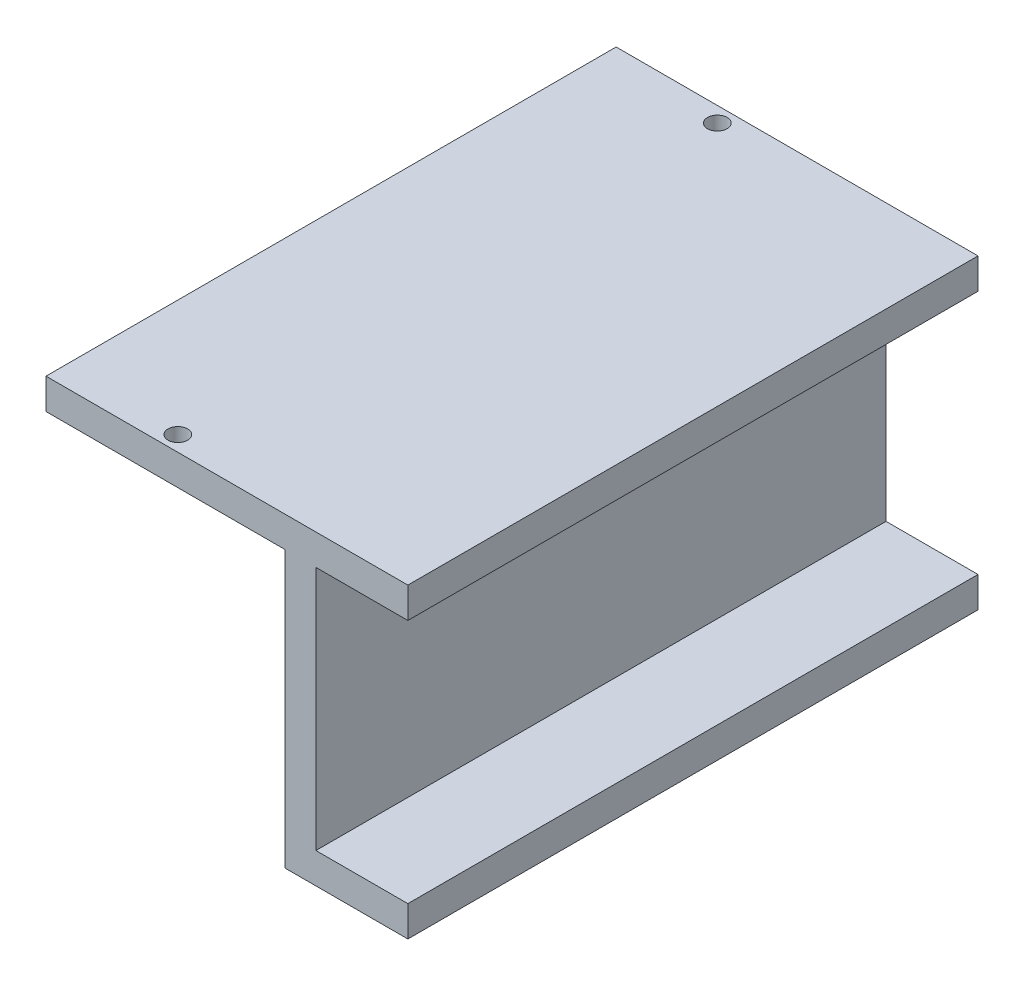
ISO-10303-21;
HEADER;
FILE_DESCRIPTION(('STEP AP214'),'2;1');
FILE_NAME('part.step','',(''),(''),'','','');
FILE_SCHEMA(('AUTOMOTIVE_DESIGN { 1 0 10303 214 1 1 1 1 }'));
ENDSEC;
DATA;
#1=APPLICATION_CONTEXT('core data for automotive mechanical design processes');
#2=APPLICATION_PROTOCOL_DEFINITION('international standard','automotive_design',2000,#1);
#3=PRODUCT_CONTEXT('',#1,'mechanical');
#4=PRODUCT('Part','Part','',(#3));
#5=PRODUCT_RELATED_PRODUCT_CATEGORY('part','',(#4));
#6=PRODUCT_DEFINITION_FORMATION('','',#4);
#7=PRODUCT_DEFINITION_CONTEXT('part definition',#1,'design');
#8=PRODUCT_DEFINITION('design','',#6,#7);
#9=PRODUCT_DEFINITION_SHAPE('','',#8);
#10=(LENGTH_UNIT() NAMED_UNIT(*) SI_UNIT(.MILLI.,.METRE.));
#11=(NAMED_UNIT(*) PLANE_ANGLE_UNIT() SI_UNIT($,.RADIAN.));
#12=(NAMED_UNIT(*) SI_UNIT($,.STERADIAN.) SOLID_ANGLE_UNIT());
#13=UNCERTAINTY_MEASURE_WITH_UNIT(LENGTH_MEASURE(1.E-05),#10,'distance_accuracy_value','');
#14=(GEOMETRIC_REPRESENTATION_CONTEXT(3) GLOBAL_UNCERTAINTY_ASSIGNED_CONTEXT((#13)) GLOBAL_UNIT_ASSIGNED_CONTEXT((#10,
#11,#12)) REPRESENTATION_CONTEXT('',''));
#15=CARTESIAN_POINT('',(0.,0.,0.));
#16=DIRECTION('',(0.,0.,1.));
#17=DIRECTION('',(1.,0.,0.));
#18=AXIS2_PLACEMENT_3D('',#15,#16,#17);
#19=CARTESIAN_POINT('',(-15.,-509.409867616983,-170.356079300492));
#20=DIRECTION('',(1.,0.,0.));
#21=DIRECTION('',(0.,0.,-1.));
#22=AXIS2_PLACEMENT_3D('',#19,#20,#21);
#23=PLANE('',#22);
#24=DIRECTION('',(0.,-1.,0.));
#25=VECTOR('',#24,1.);
#26=CARTESIAN_POINT('',(-15.,-509.409867616983,-93.));
#27=LINE('',#26,#25);
#28=CARTESIAN_POINT('',(-15.,-469.409867616982,-93.));
#29=VERTEX_POINT('',#28);
#30=CARTESIAN_POINT('',(-15.,-509.409867616983,-93.));
#31=VERTEX_POINT('',#30);
#32=EDGE_CURVE('E42',#29,#31,#27,.T.);
#33=ORIENTED_EDGE('',*,*,#32,.F.);
#34=DIRECTION('',(0.,0.,1.));
#35=VECTOR('',#34,1.);
#36=CARTESIAN_POINT('',(-15.,-469.409867616982,-170.356079300492));
#37=LINE('',#36,#35);
#38=CARTESIAN_POINT('',(-15.,-469.409867616982,0.));
#39=VERTEX_POINT('',#38);
#40=EDGE_CURVE('E109',#29,#39,#37,.T.);
#41=ORIENTED_EDGE('',*,*,#40,.T.);
#42=DIRECTION('',(0.,1.,0.));
#43=VECTOR('',#42,1.);
#44=CARTESIAN_POINT('',(-15.,-509.409867616983,0.));
#45=LINE('',#44,#43);
#46=CARTESIAN_POINT('',(-15.,-509.409867616983,0.));
#47=VERTEX_POINT('',#46);
#48=EDGE_CURVE('E113',#47,#39,#45,.T.);
#49=ORIENTED_EDGE('',*,*,#48,.F.);
#50=DIRECTION('',(0.,0.,1.));
#51=VECTOR('',#50,1.);
#52=CARTESIAN_POINT('',(-15.,-509.409867616983,-170.356079300492));
#53=LINE('',#52,#51);
#54=EDGE_CURVE('E158',#31,#47,#53,.T.);
#55=ORIENTED_EDGE('',*,*,#54,.F.);
#56=EDGE_LOOP('',(#33,#41,#49,#55));
#57=FACE_BOUND('',#56,.T.);
#58=ADVANCED_FACE('F35',(#57),#23,.T.);
#59=CARTESIAN_POINT('',(-15.,-509.409867616983,-170.356079300492));
#60=DIRECTION('',(0.,1.,0.));
#61=DIRECTION('',(0.,0.,1.));
#62=AXIS2_PLACEMENT_3D('',#59,#60,#61);
#63=PLANE('',#62);
#64=DIRECTION('',(1.,0.,0.));
#65=VECTOR('',#64,1.);
#66=CARTESIAN_POINT('',(-15.,-509.409867616983,-93.));
#67=LINE('',#66,#65);
#68=CARTESIAN_POINT('',(0.,-509.409867616983,-93.));
#69=VERTEX_POINT('',#68);
#70=EDGE_CURVE('E212',#31,#69,#67,.T.);
#71=ORIENTED_EDGE('',*,*,#70,.F.);
#72=ORIENTED_EDGE('',*,*,#54,.T.);
#73=DIRECTION('',(-1.,0.,0.));
#74=VECTOR('',#73,1.);
#75=CARTESIAN_POINT('',(-15.,-509.409867616983,0.));
#76=LINE('',#75,#74);
#77=CARTESIAN_POINT('',(0.,-509.409867616983,0.));
#78=VERTEX_POINT('',#77);
#79=EDGE_CURVE('E118',#78,#47,#76,.T.);
#80=ORIENTED_EDGE('',*,*,#79,.F.);
#81=DIRECTION('',(0.,0.,1.));
#82=VECTOR('',#81,1.);
#83=CARTESIAN_POINT('',(0.,-509.409867616983,-170.356079300492));
#84=LINE('',#83,#82);
#85=EDGE_CURVE('E161',#69,#78,#84,.T.);
#86=ORIENTED_EDGE('',*,*,#85,.F.);
#87=EDGE_LOOP('',(#71,#72,#80,#86));
#88=FACE_BOUND('',#87,.T.);
#89=ADVANCED_FACE('F211',(#88),#63,.T.);
#90=CARTESIAN_POINT('',(0.,-514.409867616983,-170.356079300492));
#91=DIRECTION('',(1.,0.,0.));
#92=DIRECTION('',(0.,1.,0.));
#93=AXIS2_PLACEMENT_3D('',#90,#91,#92);
#94=PLANE('',#93);
#95=DIRECTION('',(0.,-1.,0.));
#96=VECTOR('',#95,1.);
#97=CARTESIAN_POINT('',(0.,-514.409867616983,-93.));
#98=LINE('',#97,#96);
#99=CARTESIAN_POINT('',(0.,-514.409867616983,-93.));
#100=VERTEX_POINT('',#99);
#101=EDGE_CURVE('E208',#69,#100,#98,.T.);
#102=ORIENTED_EDGE('',*,*,#101,.F.);
#103=ORIENTED_EDGE('',*,*,#85,.T.);
#104=DIRECTION('',(0.,1.,0.));
#105=VECTOR('',#104,1.);
#106=CARTESIAN_POINT('',(0.,-514.409867616983,0.));
#107=LINE('',#106,#105);
#108=CARTESIAN_POINT('',(0.,-514.409867616983,0.));
#109=VERTEX_POINT('',#108);
#110=EDGE_CURVE('E155',#109,#78,#107,.T.);
#111=ORIENTED_EDGE('',*,*,#110,.F.);
#112=DIRECTION('',(0.,0.,1.));
#113=VECTOR('',#112,1.);
#114=CARTESIAN_POINT('',(0.,-514.409867616983,-170.356079300492));
#115=LINE('',#114,#113);
#116=EDGE_CURVE('E163',#100,#109,#115,.T.);
#117=ORIENTED_EDGE('',*,*,#116,.F.);
#118=EDGE_LOOP('',(#102,#103,#111,#117));
#119=FACE_BOUND('',#118,.T.);
#120=ADVANCED_FACE('F206',(#119),#94,.T.);
#121=CARTESIAN_POINT('',(-20.,-514.409867616983,-170.356079300492));
#122=DIRECTION('',(0.,-1.,0.));
#123=DIRECTION('',(0.,0.,-1.));
#124=AXIS2_PLACEMENT_3D('',#121,#122,#123);
#125=PLANE('',#124);
#126=DIRECTION('',(-1.,0.,0.));
#127=VECTOR('',#126,1.);
#128=CARTESIAN_POINT('',(-20.,-514.409867616983,-93.));
#129=LINE('',#128,#127);
#130=CARTESIAN_POINT('',(-20.,-514.409867616983,-93.));
#131=VERTEX_POINT('',#130);
#132=EDGE_CURVE('E203',#100,#131,#129,.T.);
#133=ORIENTED_EDGE('',*,*,#132,.F.);
#134=ORIENTED_EDGE('',*,*,#116,.T.);
#135=DIRECTION('',(1.,0.,0.));
#136=VECTOR('',#135,1.);
#137=CARTESIAN_POINT('',(-20.,-514.409867616983,0.));
#138=LINE('',#137,#136);
#139=CARTESIAN_POINT('',(-20.,-514.409867616983,0.));
#140=VERTEX_POINT('',#139);
#141=EDGE_CURVE('E152',#140,#109,#138,.T.);
#142=ORIENTED_EDGE('',*,*,#141,.F.);
#143=DIRECTION('',(0.,0.,1.));
#144=VECTOR('',#143,1.);
#145=CARTESIAN_POINT('',(-20.,-514.409867616983,-170.356079300492));
#146=LINE('',#145,#144);
#147=EDGE_CURVE('E165',#131,#140,#146,.T.);
#148=ORIENTED_EDGE('',*,*,#147,.F.);
#149=EDGE_LOOP('',(#133,#134,#142,#148));
#150=FACE_BOUND('',#149,.T.);
#151=ADVANCED_FACE('F201',(#150),#125,.T.);
#152=CARTESIAN_POINT('',(-20.,-469.409867616982,-170.356079300492));
#153=DIRECTION('',(-1.,0.,0.));
#154=DIRECTION('',(0.,0.,1.));
#155=AXIS2_PLACEMENT_3D('',#152,#153,#154);
#156=PLANE('',#155);
#157=DIRECTION('',(0.,1.,0.));
#158=VECTOR('',#157,1.);
#159=CARTESIAN_POINT('',(-20.,-469.409867616982,-93.));
#160=LINE('',#159,#158);
#161=CARTESIAN_POINT('',(-20.,-469.409867616982,-93.));
#162=VERTEX_POINT('',#161);
#163=EDGE_CURVE('E216',#131,#162,#160,.T.);
#164=ORIENTED_EDGE('',*,*,#163,.F.);
#165=ORIENTED_EDGE('',*,*,#147,.T.);
#166=DIRECTION('',(0.,-1.,0.));
#167=VECTOR('',#166,1.);
#168=CARTESIAN_POINT('',(-20.,-469.409867616982,0.));
#169=LINE('',#168,#167);
#170=CARTESIAN_POINT('',(-20.,-469.409867616982,0.));
#171=VERTEX_POINT('',#170);
#172=EDGE_CURVE('E149',#171,#140,#169,.T.);
#173=ORIENTED_EDGE('',*,*,#172,.F.);
#174=DIRECTION('',(0.,0.,1.));
#175=VECTOR('',#174,1.);
#176=CARTESIAN_POINT('',(-20.,-469.409867616982,-170.356079300492));
#177=LINE('',#176,#175);
#178=EDGE_CURVE('E167',#162,#171,#177,.T.);
#179=ORIENTED_EDGE('',*,*,#178,.F.);
#180=EDGE_LOOP('',(#164,#165,#173,#179));
#181=FACE_BOUND('',#180,.T.);
#182=ADVANCED_FACE('F195',(#181),#156,.T.);
#183=CARTESIAN_POINT('',(-20.,-469.409867616982,-170.356079300492));
#184=DIRECTION('',(0.,-1.,0.));
#185=DIRECTION('',(0.,0.,-1.));
#186=AXIS2_PLACEMENT_3D('',#183,#184,#185);
#187=PLANE('',#186);
#188=CARTESIAN_POINT('',(-40.0251048685548,-469.409867616982,-90.5));
#189=DIRECTION('',(0.,-1.,0.));
#190=DIRECTION('',(0.,0.,-1.));
#191=AXIS2_PLACEMENT_3D('',#188,#189,#190);
#192=CIRCLE('',#191,1.60000000000001);
#193=CARTESIAN_POINT('',(-40.0251048685548,-469.409867616982,-92.1));
#194=VERTEX_POINT('',#193);
#195=EDGE_CURVE('E131',#194,#194,#192,.T.);
#196=ORIENTED_EDGE('',*,*,#195,.F.);
#197=EDGE_LOOP('',(#196));
#198=FACE_BOUND('',#197,.T.);
#199=CARTESIAN_POINT('',(-40.0251048685548,-469.409867616982,-2.50000000000002));
#200=DIRECTION('',(0.,-1.,0.));
#201=DIRECTION('',(0.,0.,-1.));
#202=AXIS2_PLACEMENT_3D('',#199,#200,#201);
#203=CIRCLE('',#202,1.6);
#204=CARTESIAN_POINT('',(-40.0251048685548,-469.409867616982,-4.10000000000001));
#205=VERTEX_POINT('',#204);
#206=EDGE_CURVE('E134',#205,#205,#203,.T.);
#207=ORIENTED_EDGE('',*,*,#206,.F.);
#208=EDGE_LOOP('',(#207));
#209=FACE_BOUND('',#208,.T.);
#210=DIRECTION('',(-1.,0.,0.));
#211=VECTOR('',#210,1.);
#212=CARTESIAN_POINT('',(-20.,-469.409867616982,-93.));
#213=LINE('',#212,#211);
#214=CARTESIAN_POINT('',(-59.0251048685549,-469.409867616982,-93.));
#215=VERTEX_POINT('',#214);
#216=EDGE_CURVE('E192',#162,#215,#213,.T.);
#217=ORIENTED_EDGE('',*,*,#216,.F.);
#218=ORIENTED_EDGE('',*,*,#178,.T.);
#219=DIRECTION('',(1.,0.,0.));
#220=VECTOR('',#219,1.);
#221=CARTESIAN_POINT('',(-20.,-469.409867616982,0.));
#222=LINE('',#221,#220);
#223=CARTESIAN_POINT('',(-59.0251048685549,-469.409867616982,0.));
#224=VERTEX_POINT('',#223);
#225=EDGE_CURVE('E146',#224,#171,#222,.T.);
#226=ORIENTED_EDGE('',*,*,#225,.F.);
#227=DIRECTION('',(0.,0.,1.));
#228=VECTOR('',#227,1.);
#229=CARTESIAN_POINT('',(-59.0251048685549,-469.409867616982,-170.356079300492));
#230=LINE('',#229,#228);
#231=EDGE_CURVE('E169',#215,#224,#230,.T.);
#232=ORIENTED_EDGE('',*,*,#231,.F.);
#233=EDGE_LOOP('',(#217,#218,#226,#232));
#234=FACE_BOUND('',#233,.T.);
#235=ADVANCED_FACE('F189',(#198,#209,#234),#187,.T.);
#236=CARTESIAN_POINT('',(-59.0251048685549,-469.409867616982,-170.356079300492));
#237=DIRECTION('',(-1.,0.,0.));
#238=DIRECTION('',(0.,0.,1.));
#239=AXIS2_PLACEMENT_3D('',#236,#237,#238);
#240=PLANE('',#239);
#241=DIRECTION('',(0.,1.,0.));
#242=VECTOR('',#241,1.);
#243=CARTESIAN_POINT('',(-59.0251048685549,-469.409867616982,-93.));
#244=LINE('',#243,#242);
#245=CARTESIAN_POINT('',(-59.0251048685549,-464.409867616982,-93.));
#246=VERTEX_POINT('',#245);
#247=EDGE_CURVE('E54',#215,#246,#244,.T.);
#248=ORIENTED_EDGE('',*,*,#247,.F.);
#249=ORIENTED_EDGE('',*,*,#231,.T.);
#250=DIRECTION('',(0.,-1.,0.));
#251=VECTOR('',#250,1.);
#252=CARTESIAN_POINT('',(-59.0251048685549,-469.409867616982,0.));
#253=LINE('',#252,#251);
#254=CARTESIAN_POINT('',(-59.0251048685549,-464.409867616982,0.));
#255=VERTEX_POINT('',#254);
#256=EDGE_CURVE('E143',#255,#224,#253,.T.);
#257=ORIENTED_EDGE('',*,*,#256,.F.);
#258=DIRECTION('',(0.,0.,1.));
#259=VECTOR('',#258,1.);
#260=CARTESIAN_POINT('',(-59.0251048685549,-464.409867616982,-170.356079300492));
#261=LINE('',#260,#259);
#262=EDGE_CURVE('E171',#246,#255,#261,.T.);
#263=ORIENTED_EDGE('',*,*,#262,.F.);
#264=EDGE_LOOP('',(#248,#249,#257,#263));
#265=FACE_BOUND('',#264,.T.);
#266=ADVANCED_FACE('F185',(#265),#240,.T.);
#267=CARTESIAN_POINT('',(-59.0251048685549,-464.409867616982,-170.356079300492));
#268=DIRECTION('',(0.,1.,0.));
#269=DIRECTION('',(0.,0.,1.));
#270=AXIS2_PLACEMENT_3D('',#267,#268,#269);
#271=PLANE('',#270);
#272=CARTESIAN_POINT('',(-40.0251048685548,-464.409867616982,-90.5));
#273=DIRECTION('',(0.,1.,0.));
#274=DIRECTION('',(0.,0.,1.));
#275=AXIS2_PLACEMENT_3D('',#272,#273,#274);
#276=CIRCLE('',#275,1.60000000000001);
#277=CARTESIAN_POINT('',(-40.0251048685548,-464.409867616982,-88.9));
#278=VERTEX_POINT('',#277);
#279=EDGE_CURVE('E224',#278,#278,#276,.T.);
#280=ORIENTED_EDGE('',*,*,#279,.F.);
#281=EDGE_LOOP('',(#280));
#282=FACE_BOUND('',#281,.T.);
#283=CARTESIAN_POINT('',(-40.0251048685548,-464.409867616982,-2.50000000000002));
#284=DIRECTION('',(0.,1.,0.));
#285=DIRECTION('',(0.,0.,1.));
#286=AXIS2_PLACEMENT_3D('',#283,#284,#285);
#287=CIRCLE('',#286,1.6);
#288=CARTESIAN_POINT('',(-40.0251048685548,-464.409867616982,-0.900000000000018));
#289=VERTEX_POINT('',#288);
#290=EDGE_CURVE('E225',#289,#289,#287,.T.);
#291=ORIENTED_EDGE('',*,*,#290,.F.);
#292=EDGE_LOOP('',(#291));
#293=FACE_BOUND('',#292,.T.);
#294=DIRECTION('',(1.,0.,0.));
#295=VECTOR('',#294,1.);
#296=CARTESIAN_POINT('',(-59.0251048685549,-464.409867616982,-93.));
#297=LINE('',#296,#295);
#298=CARTESIAN_POINT('',(0.,-464.409867616982,-93.));
#299=VERTEX_POINT('',#298);
#300=EDGE_CURVE('E49',#246,#299,#297,.T.);
#301=ORIENTED_EDGE('',*,*,#300,.F.);
#302=ORIENTED_EDGE('',*,*,#262,.T.);
#303=DIRECTION('',(-1.,0.,0.));
#304=VECTOR('',#303,1.);
#305=CARTESIAN_POINT('',(-59.0251048685549,-464.409867616982,0.));
#306=LINE('',#305,#304);
#307=CARTESIAN_POINT('',(0.,-464.409867616982,0.));
#308=VERTEX_POINT('',#307);
#309=EDGE_CURVE('E140',#308,#255,#306,.T.);
#310=ORIENTED_EDGE('',*,*,#309,.F.);
#311=DIRECTION('',(0.,0.,1.));
#312=VECTOR('',#311,1.);
#313=CARTESIAN_POINT('',(0.,-464.409867616982,-170.356079300492));
#314=LINE('',#313,#312);
#315=EDGE_CURVE('E173',#299,#308,#314,.T.);
#316=ORIENTED_EDGE('',*,*,#315,.F.);
#317=EDGE_LOOP('',(#301,#302,#310,#316));
#318=FACE_BOUND('',#317,.T.);
#319=ADVANCED_FACE('F180',(#282,#293,#318),#271,.T.);
#320=CARTESIAN_POINT('',(0.,-469.409867616982,-170.356079300492));
#321=DIRECTION('',(1.,0.,0.));
#322=DIRECTION('',(0.,1.,0.));
#323=AXIS2_PLACEMENT_3D('',#320,#321,#322);
#324=PLANE('',#323);
#325=DIRECTION('',(0.,-1.,0.));
#326=VECTOR('',#325,1.);
#327=CARTESIAN_POINT('',(0.,-469.409867616982,-93.));
#328=LINE('',#327,#326);
#329=CARTESIAN_POINT('',(0.,-469.409867616982,-93.));
#330=VERTEX_POINT('',#329);
#331=EDGE_CURVE('E160',#299,#330,#328,.T.);
#332=ORIENTED_EDGE('',*,*,#331,.F.);
#333=ORIENTED_EDGE('',*,*,#315,.T.);
#334=DIRECTION('',(0.,1.,0.));
#335=VECTOR('',#334,1.);
#336=CARTESIAN_POINT('',(0.,-469.409867616982,0.));
#337=LINE('',#336,#335);
#338=CARTESIAN_POINT('',(0.,-469.409867616982,0.));
#339=VERTEX_POINT('',#338);
#340=EDGE_CURVE('E126',#339,#308,#337,.T.);
#341=ORIENTED_EDGE('',*,*,#340,.F.);
#342=DIRECTION('',(0.,0.,1.));
#343=VECTOR('',#342,1.);
#344=CARTESIAN_POINT('',(0.,-469.409867616982,-170.356079300492));
#345=LINE('',#344,#343);
#346=EDGE_CURVE('E117',#330,#339,#345,.T.);
#347=ORIENTED_EDGE('',*,*,#346,.F.);
#348=EDGE_LOOP('',(#332,#333,#341,#347));
#349=FACE_BOUND('',#348,.T.);
#350=ADVANCED_FACE('F178',(#349),#324,.T.);
#351=CARTESIAN_POINT('',(-15.,-469.409867616982,-170.356079300492));
#352=DIRECTION('',(0.,-1.,0.));
#353=DIRECTION('',(0.,0.,-1.));
#354=AXIS2_PLACEMENT_3D('',#351,#352,#353);
#355=PLANE('',#354);
#356=DIRECTION('',(-1.,0.,0.));
#357=VECTOR('',#356,1.);
#358=CARTESIAN_POINT('',(-15.,-469.409867616982,-93.));
#359=LINE('',#358,#357);
#360=EDGE_CURVE('E11',#330,#29,#359,.T.);
#361=ORIENTED_EDGE('',*,*,#360,.F.);
#362=ORIENTED_EDGE('',*,*,#346,.T.);
#363=DIRECTION('',(1.,0.,0.));
#364=VECTOR('',#363,1.);
#365=CARTESIAN_POINT('',(-15.,-469.409867616982,0.));
#366=LINE('',#365,#364);
#367=EDGE_CURVE('E120',#39,#339,#366,.T.);
#368=ORIENTED_EDGE('',*,*,#367,.F.);
#369=ORIENTED_EDGE('',*,*,#40,.F.);
#370=EDGE_LOOP('',(#361,#362,#368,#369));
#371=FACE_BOUND('',#370,.T.);
#372=ADVANCED_FACE('F121',(#371),#355,.T.);
#373=CARTESIAN_POINT('',(0.,0.,0.));
#374=DIRECTION('',(0.,0.,-1.));
#375=DIRECTION('',(-1.,0.,0.));
#376=AXIS2_PLACEMENT_3D('',#373,#374,#375);
#377=PLANE('',#376);
#378=ORIENTED_EDGE('',*,*,#48,.T.);
#379=ORIENTED_EDGE('',*,*,#367,.T.);
#380=ORIENTED_EDGE('',*,*,#340,.T.);
#381=ORIENTED_EDGE('',*,*,#309,.T.);
#382=ORIENTED_EDGE('',*,*,#256,.T.);
#383=ORIENTED_EDGE('',*,*,#225,.T.);
#384=ORIENTED_EDGE('',*,*,#172,.T.);
#385=ORIENTED_EDGE('',*,*,#141,.T.);
#386=ORIENTED_EDGE('',*,*,#110,.T.);
#387=ORIENTED_EDGE('',*,*,#79,.T.);
#388=EDGE_LOOP('',(#378,#379,#380,#381,#382,#383,#384,#385,#386,#387));
#389=FACE_BOUND('',#388,.T.);
#390=ADVANCED_FACE('F128',(#389),#377,.F.);
#391=CARTESIAN_POINT('',(-107.525104868555,-462.909867616982,-93.));
#392=DIRECTION('',(0.,0.,1.));
#393=DIRECTION('',(-1.,0.,0.));
#394=AXIS2_PLACEMENT_3D('',#391,#392,#393);
#395=PLANE('',#394);
#396=ORIENTED_EDGE('',*,*,#32,.T.);
#397=ORIENTED_EDGE('',*,*,#70,.T.);
#398=ORIENTED_EDGE('',*,*,#101,.T.);
#399=ORIENTED_EDGE('',*,*,#132,.T.);
#400=ORIENTED_EDGE('',*,*,#163,.T.);
#401=ORIENTED_EDGE('',*,*,#216,.T.);
#402=ORIENTED_EDGE('',*,*,#247,.T.);
#403=ORIENTED_EDGE('',*,*,#300,.T.);
#404=ORIENTED_EDGE('',*,*,#331,.T.);
#405=ORIENTED_EDGE('',*,*,#360,.T.);
#406=EDGE_LOOP('',(#396,#397,#398,#399,#400,#401,#402,#403,#404,#405));
#407=FACE_BOUND('',#406,.T.);
#408=ADVANCED_FACE('F240',(#407),#395,.F.);
#409=CARTESIAN_POINT('',(-40.0251048685548,-514.409867616983,-2.50000000000002));
#410=DIRECTION('',(0.,1.,0.));
#411=DIRECTION('',(0.,0.,1.));
#412=AXIS2_PLACEMENT_3D('',#409,#410,#411);
#413=CYLINDRICAL_SURFACE('',#412,1.6);
#414=ORIENTED_EDGE('',*,*,#206,.T.);
#415=EDGE_LOOP('',(#414));
#416=FACE_BOUND('',#415,.T.);
#417=ORIENTED_EDGE('',*,*,#290,.T.);
#418=EDGE_LOOP('',(#417));
#419=FACE_BOUND('',#418,.T.);
#420=ADVANCED_FACE('F238',(#416,#419),#413,.F.);
#421=CARTESIAN_POINT('',(-40.0251048685548,-514.409867616983,-90.5));
#422=DIRECTION('',(0.,1.,0.));
#423=DIRECTION('',(0.,0.,1.));
#424=AXIS2_PLACEMENT_3D('',#421,#422,#423);
#425=CYLINDRICAL_SURFACE('',#424,1.60000000000001);
#426=ORIENTED_EDGE('',*,*,#195,.T.);
#427=EDGE_LOOP('',(#426));
#428=FACE_BOUND('',#427,.T.);
#429=ORIENTED_EDGE('',*,*,#279,.T.);
#430=EDGE_LOOP('',(#429));
#431=FACE_BOUND('',#430,.T.);
#432=ADVANCED_FACE('F231',(#428,#431),#425,.F.);
#433=CLOSED_SHELL('',(#58,#89,#120,#151,#182,#235,#266,#319,#350,#372,#390,#408,#420,#432));
#434=MANIFOLD_SOLID_BREP('B2',#433);
#435=ADVANCED_BREP_SHAPE_REPRESENTATION('',(#18,#434),#14);
#436=SHAPE_DEFINITION_REPRESENTATION(#9,#435);
ENDSEC;
END-ISO-10303-21;
